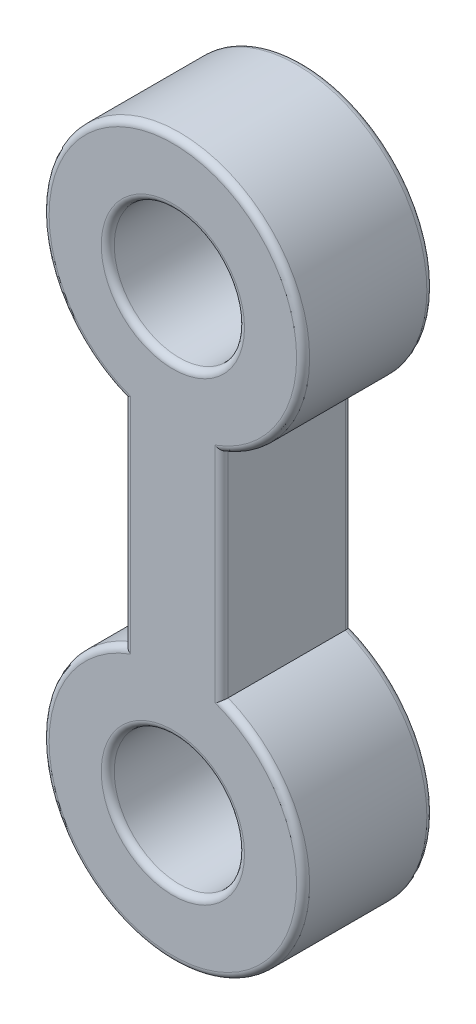
ISO-10303-21;
HEADER;
FILE_DESCRIPTION(('STEP AP214'),'2;1');
FILE_NAME('part.step','',(''),(''),'','','');
FILE_SCHEMA(('AUTOMOTIVE_DESIGN { 1 0 10303 214 1 1 1 1 }'));
ENDSEC;
DATA;
#1=APPLICATION_CONTEXT('core data for automotive mechanical design processes');
#2=APPLICATION_PROTOCOL_DEFINITION('international standard','automotive_design',2000,#1);
#3=PRODUCT_CONTEXT('',#1,'mechanical');
#4=PRODUCT('Part','Part','',(#3));
#5=PRODUCT_RELATED_PRODUCT_CATEGORY('part','',(#4));
#6=PRODUCT_DEFINITION_FORMATION('','',#4);
#7=PRODUCT_DEFINITION_CONTEXT('part definition',#1,'design');
#8=PRODUCT_DEFINITION('design','',#6,#7);
#9=PRODUCT_DEFINITION_SHAPE('','',#8);
#10=(LENGTH_UNIT() NAMED_UNIT(*) SI_UNIT(.MILLI.,.METRE.));
#11=(NAMED_UNIT(*) PLANE_ANGLE_UNIT() SI_UNIT($,.RADIAN.));
#12=(NAMED_UNIT(*) SI_UNIT($,.STERADIAN.) SOLID_ANGLE_UNIT());
#13=UNCERTAINTY_MEASURE_WITH_UNIT(LENGTH_MEASURE(1.E-05),#10,'distance_accuracy_value','');
#14=(GEOMETRIC_REPRESENTATION_CONTEXT(3) GLOBAL_UNCERTAINTY_ASSIGNED_CONTEXT((#13)) GLOBAL_UNIT_ASSIGNED_CONTEXT((#10,
#11,#12)) REPRESENTATION_CONTEXT('',''));
#15=CARTESIAN_POINT('',(0.,0.,0.));
#16=DIRECTION('',(0.,0.,1.));
#17=DIRECTION('',(1.,0.,0.));
#18=AXIS2_PLACEMENT_3D('',#15,#16,#17);
#19=CARTESIAN_POINT('',(0.,0.,10.));
#20=DIRECTION('',(0.,0.,1.));
#21=DIRECTION('',(1.,0.,0.));
#22=AXIS2_PLACEMENT_3D('',#19,#20,#21);
#23=PLANE('',#22);
#24=CARTESIAN_POINT('',(0.,-70.,10.));
#25=DIRECTION('',(0.,0.,1.));
#26=DIRECTION('',(1.,0.,0.));
#27=AXIS2_PLACEMENT_3D('',#24,#25,#26);
#28=CIRCLE('',#27,11.);
#29=CARTESIAN_POINT('',(11.,-70.,10.));
#30=VERTEX_POINT('',#29);
#31=EDGE_CURVE('E11',#30,#30,#28,.F.);
#32=ORIENTED_EDGE('',*,*,#31,.T.);
#33=EDGE_LOOP('',(#32));
#34=FACE_BOUND('',#33,.T.);
#35=CARTESIAN_POINT('',(0.,-70.,10.));
#36=DIRECTION('',(0.,0.,1.));
#37=DIRECTION('',(1.,0.,0.));
#38=AXIS2_PLACEMENT_3D('',#35,#36,#37);
#39=CIRCLE('',#38,19.);
#40=CARTESIAN_POINT('',(-6.49999999999999,-52.1464289286429,10.));
#41=VERTEX_POINT('',#40);
#42=CARTESIAN_POINT('',(6.50000000000001,-52.1464289286429,10.));
#43=VERTEX_POINT('',#42);
#44=EDGE_CURVE('E54',#41,#43,#39,.T.);
#45=ORIENTED_EDGE('',*,*,#44,.T.);
#46=DIRECTION('',(0.,1.,0.));
#47=VECTOR('',#46,1.);
#48=CARTESIAN_POINT('',(6.5,-18.5404962177392,10.));
#49=LINE('',#48,#47);
#50=CARTESIAN_POINT('',(6.5,-17.8535710713571,10.));
#51=VERTEX_POINT('',#50);
#52=EDGE_CURVE('E46',#43,#51,#49,.T.);
#53=ORIENTED_EDGE('',*,*,#52,.T.);
#54=CARTESIAN_POINT('',(0.,0.,10.));
#55=DIRECTION('',(0.,0.,1.));
#56=DIRECTION('',(1.,0.,0.));
#57=AXIS2_PLACEMENT_3D('',#54,#55,#56);
#58=CIRCLE('',#57,19.);
#59=CARTESIAN_POINT('',(-6.5,-17.8535710713571,10.));
#60=VERTEX_POINT('',#59);
#61=EDGE_CURVE('E172',#51,#60,#58,.T.);
#62=ORIENTED_EDGE('',*,*,#61,.T.);
#63=DIRECTION('',(0.,-1.,0.));
#64=VECTOR('',#63,1.);
#65=CARTESIAN_POINT('',(-6.49999999999999,-51.4595037822608,10.));
#66=LINE('',#65,#64);
#67=EDGE_CURVE('E59',#60,#41,#66,.T.);
#68=ORIENTED_EDGE('',*,*,#67,.T.);
#69=EDGE_LOOP('',(#45,#53,#62,#68));
#70=FACE_BOUND('',#69,.T.);
#71=CARTESIAN_POINT('',(0.,0.,10.));
#72=DIRECTION('',(0.,0.,1.));
#73=DIRECTION('',(1.,0.,0.));
#74=AXIS2_PLACEMENT_3D('',#71,#72,#73);
#75=CIRCLE('',#74,11.);
#76=CARTESIAN_POINT('',(11.,0.,10.));
#77=VERTEX_POINT('',#76);
#78=EDGE_CURVE('E169',#77,#77,#75,.F.);
#79=ORIENTED_EDGE('',*,*,#78,.T.);
#80=EDGE_LOOP('',(#79));
#81=FACE_BOUND('',#80,.T.);
#82=ADVANCED_FACE('F32',(#34,#70,#81),#23,.T.);
#83=CARTESIAN_POINT('',(0.,0.,-10.));
#84=DIRECTION('',(0.,0.,1.));
#85=DIRECTION('',(1.,0.,0.));
#86=AXIS2_PLACEMENT_3D('',#83,#84,#85);
#87=PLANE('',#86);
#88=CARTESIAN_POINT('',(0.,-70.,-10.));
#89=DIRECTION('',(0.,0.,1.));
#90=DIRECTION('',(1.,0.,0.));
#91=AXIS2_PLACEMENT_3D('',#88,#89,#90);
#92=CIRCLE('',#91,11.);
#93=CARTESIAN_POINT('',(11.,-70.,-10.));
#94=VERTEX_POINT('',#93);
#95=EDGE_CURVE('E134',#94,#94,#92,.T.);
#96=ORIENTED_EDGE('',*,*,#95,.T.);
#97=EDGE_LOOP('',(#96));
#98=FACE_BOUND('',#97,.T.);
#99=CARTESIAN_POINT('',(0.,0.,-10.));
#100=DIRECTION('',(0.,0.,1.));
#101=DIRECTION('',(1.,0.,0.));
#102=AXIS2_PLACEMENT_3D('',#99,#100,#101);
#103=CIRCLE('',#102,11.);
#104=CARTESIAN_POINT('',(11.,0.,-10.));
#105=VERTEX_POINT('',#104);
#106=EDGE_CURVE('E131',#105,#105,#103,.T.);
#107=ORIENTED_EDGE('',*,*,#106,.T.);
#108=EDGE_LOOP('',(#107));
#109=FACE_BOUND('',#108,.T.);
#110=CARTESIAN_POINT('',(0.,-70.,-10.));
#111=DIRECTION('',(0.,0.,1.));
#112=DIRECTION('',(1.,0.,0.));
#113=AXIS2_PLACEMENT_3D('',#110,#111,#112);
#114=CIRCLE('',#113,19.);
#115=CARTESIAN_POINT('',(6.50000000000001,-52.1464289286429,-10.));
#116=VERTEX_POINT('',#115);
#117=CARTESIAN_POINT('',(-6.49999999999999,-52.1464289286429,-10.));
#118=VERTEX_POINT('',#117);
#119=EDGE_CURVE('E130',#116,#118,#114,.F.);
#120=ORIENTED_EDGE('',*,*,#119,.T.);
#121=DIRECTION('',(0.,-1.,0.));
#122=VECTOR('',#121,1.);
#123=CARTESIAN_POINT('',(-6.5,0.,-10.));
#124=LINE('',#123,#122);
#125=CARTESIAN_POINT('',(-6.5,-17.8535710713571,-10.));
#126=VERTEX_POINT('',#125);
#127=EDGE_CURVE('E109',#118,#126,#124,.F.);
#128=ORIENTED_EDGE('',*,*,#127,.T.);
#129=CARTESIAN_POINT('',(0.,0.,-10.));
#130=DIRECTION('',(0.,0.,1.));
#131=DIRECTION('',(1.,0.,0.));
#132=AXIS2_PLACEMENT_3D('',#129,#130,#131);
#133=CIRCLE('',#132,19.);
#134=CARTESIAN_POINT('',(6.5,-17.8535710713571,-10.));
#135=VERTEX_POINT('',#134);
#136=EDGE_CURVE('E119',#126,#135,#133,.F.);
#137=ORIENTED_EDGE('',*,*,#136,.T.);
#138=DIRECTION('',(0.,1.,0.));
#139=VECTOR('',#138,1.);
#140=CARTESIAN_POINT('',(6.5,0.,-10.));
#141=LINE('',#140,#139);
#142=EDGE_CURVE('E125',#135,#116,#141,.F.);
#143=ORIENTED_EDGE('',*,*,#142,.T.);
#144=EDGE_LOOP('',(#120,#128,#137,#143));
#145=FACE_BOUND('',#144,.T.);
#146=ADVANCED_FACE('F128',(#98,#109,#145),#87,.F.);
#147=CARTESIAN_POINT('',(0.,0.,10.));
#148=DIRECTION('',(0.,0.,-1.));
#149=DIRECTION('',(-1.,0.,0.));
#150=AXIS2_PLACEMENT_3D('',#147,#148,#149);
#151=CYLINDRICAL_SURFACE('',#150,20.);
#152=DIRECTION('',(0.,0.,-1.));
#153=VECTOR('',#152,1.);
#154=CARTESIAN_POINT('',(7.5,-18.5404962177392,10.));
#155=LINE('',#154,#153);
#156=CARTESIAN_POINT('',(7.5,-18.5404962177392,9.));
#157=VERTEX_POINT('',#156);
#158=CARTESIAN_POINT('',(7.5,-18.5404962177392,-9.));
#159=VERTEX_POINT('',#158);
#160=EDGE_CURVE('E325',#157,#159,#155,.T.);
#161=ORIENTED_EDGE('',*,*,#160,.T.);
#162=CARTESIAN_POINT('',(0.,0.,-9.));
#163=DIRECTION('',(0.,0.,1.));
#164=DIRECTION('',(1.,0.,0.));
#165=AXIS2_PLACEMENT_3D('',#162,#163,#164);
#166=CIRCLE('',#165,20.);
#167=CARTESIAN_POINT('',(-7.5,-18.5404962177392,-9.));
#168=VERTEX_POINT('',#167);
#169=EDGE_CURVE('E167',#159,#168,#166,.T.);
#170=ORIENTED_EDGE('',*,*,#169,.T.);
#171=DIRECTION('',(0.,0.,-1.));
#172=VECTOR('',#171,1.);
#173=CARTESIAN_POINT('',(-7.5,-18.5404962177392,10.));
#174=LINE('',#173,#172);
#175=CARTESIAN_POINT('',(-7.5,-18.5404962177392,9.));
#176=VERTEX_POINT('',#175);
#177=EDGE_CURVE('E126',#176,#168,#174,.T.);
#178=ORIENTED_EDGE('',*,*,#177,.F.);
#179=CARTESIAN_POINT('',(0.,0.,9.));
#180=DIRECTION('',(0.,0.,1.));
#181=DIRECTION('',(1.,0.,0.));
#182=AXIS2_PLACEMENT_3D('',#179,#180,#181);
#183=CIRCLE('',#182,20.);
#184=EDGE_CURVE('E165',#176,#157,#183,.F.);
#185=ORIENTED_EDGE('',*,*,#184,.T.);
#186=EDGE_LOOP('',(#161,#170,#178,#185));
#187=FACE_BOUND('',#186,.T.);
#188=ADVANCED_FACE('F264',(#187),#151,.T.);
#189=CARTESIAN_POINT('',(-7.5,-18.5404962177392,10.));
#190=DIRECTION('',(1.,0.,0.));
#191=DIRECTION('',(0.,1.,0.));
#192=AXIS2_PLACEMENT_3D('',#189,#190,#191);
#193=PLANE('',#192);
#194=ORIENTED_EDGE('',*,*,#177,.T.);
#195=DIRECTION('',(0.,-1.,0.));
#196=VECTOR('',#195,1.);
#197=CARTESIAN_POINT('',(-7.5,-18.5404962177392,-9.));
#198=LINE('',#197,#196);
#199=CARTESIAN_POINT('',(-7.49999999999999,-51.4595037822608,-9.));
#200=VERTEX_POINT('',#199);
#201=EDGE_CURVE('E112',#168,#200,#198,.T.);
#202=ORIENTED_EDGE('',*,*,#201,.T.);
#203=DIRECTION('',(0.,0.,-1.));
#204=VECTOR('',#203,1.);
#205=CARTESIAN_POINT('',(-7.49999999999999,-51.4595037822608,10.));
#206=LINE('',#205,#204);
#207=CARTESIAN_POINT('',(-7.49999999999999,-51.4595037822608,9.));
#208=VERTEX_POINT('',#207);
#209=EDGE_CURVE('E327',#208,#200,#206,.T.);
#210=ORIENTED_EDGE('',*,*,#209,.F.);
#211=DIRECTION('',(0.,-1.,0.));
#212=VECTOR('',#211,1.);
#213=CARTESIAN_POINT('',(-7.5,-18.5404962177392,9.));
#214=LINE('',#213,#212);
#215=EDGE_CURVE('E153',#208,#176,#214,.F.);
#216=ORIENTED_EDGE('',*,*,#215,.T.);
#217=EDGE_LOOP('',(#194,#202,#210,#216));
#218=FACE_BOUND('',#217,.T.);
#219=ADVANCED_FACE('F278',(#218),#193,.F.);
#220=CARTESIAN_POINT('',(0.,-70.,10.));
#221=DIRECTION('',(0.,0.,-1.));
#222=DIRECTION('',(-1.,0.,0.));
#223=AXIS2_PLACEMENT_3D('',#220,#221,#222);
#224=CYLINDRICAL_SURFACE('',#223,20.);
#225=ORIENTED_EDGE('',*,*,#209,.T.);
#226=CARTESIAN_POINT('',(0.,-70.,-9.));
#227=DIRECTION('',(0.,0.,1.));
#228=DIRECTION('',(1.,0.,0.));
#229=AXIS2_PLACEMENT_3D('',#226,#227,#228);
#230=CIRCLE('',#229,20.);
#231=CARTESIAN_POINT('',(7.50000000000001,-51.4595037822608,-9.));
#232=VERTEX_POINT('',#231);
#233=EDGE_CURVE('E158',#200,#232,#230,.T.);
#234=ORIENTED_EDGE('',*,*,#233,.T.);
#235=DIRECTION('',(0.,0.,-1.));
#236=VECTOR('',#235,1.);
#237=CARTESIAN_POINT('',(7.50000000000001,-51.4595037822608,10.));
#238=LINE('',#237,#236);
#239=CARTESIAN_POINT('',(7.50000000000001,-51.4595037822608,9.));
#240=VERTEX_POINT('',#239);
#241=EDGE_CURVE('E322',#240,#232,#238,.T.);
#242=ORIENTED_EDGE('',*,*,#241,.F.);
#243=CARTESIAN_POINT('',(0.,-70.,9.));
#244=DIRECTION('',(0.,0.,1.));
#245=DIRECTION('',(1.,0.,0.));
#246=AXIS2_PLACEMENT_3D('',#243,#244,#245);
#247=CIRCLE('',#246,20.);
#248=EDGE_CURVE('E156',#240,#208,#247,.F.);
#249=ORIENTED_EDGE('',*,*,#248,.T.);
#250=EDGE_LOOP('',(#225,#234,#242,#249));
#251=FACE_BOUND('',#250,.T.);
#252=ADVANCED_FACE('F274',(#251),#224,.T.);
#253=CARTESIAN_POINT('',(7.5,-18.5404962177392,10.));
#254=DIRECTION('',(-1.,0.,0.));
#255=DIRECTION('',(0.,-1.,0.));
#256=AXIS2_PLACEMENT_3D('',#253,#254,#255);
#257=PLANE('',#256);
#258=ORIENTED_EDGE('',*,*,#241,.T.);
#259=DIRECTION('',(0.,1.,0.));
#260=VECTOR('',#259,1.);
#261=CARTESIAN_POINT('',(7.5,-18.5404962177392,-9.));
#262=LINE('',#261,#260);
#263=EDGE_CURVE('E163',#232,#159,#262,.T.);
#264=ORIENTED_EDGE('',*,*,#263,.T.);
#265=ORIENTED_EDGE('',*,*,#160,.F.);
#266=DIRECTION('',(0.,1.,0.));
#267=VECTOR('',#266,1.);
#268=CARTESIAN_POINT('',(7.50000000000001,-51.4595037822608,9.));
#269=LINE('',#268,#267);
#270=EDGE_CURVE('E160',#157,#240,#269,.F.);
#271=ORIENTED_EDGE('',*,*,#270,.T.);
#272=EDGE_LOOP('',(#258,#264,#265,#271));
#273=FACE_BOUND('',#272,.T.);
#274=ADVANCED_FACE('F271',(#273),#257,.F.);
#275=CARTESIAN_POINT('',(0.,0.,10.));
#276=DIRECTION('',(0.,0.,-1.));
#277=DIRECTION('',(-1.,0.,0.));
#278=AXIS2_PLACEMENT_3D('',#275,#276,#277);
#279=CYLINDRICAL_SURFACE('',#278,10.);
#280=CARTESIAN_POINT('',(0.,0.,-9.));
#281=DIRECTION('',(0.,0.,1.));
#282=DIRECTION('',(1.,0.,0.));
#283=AXIS2_PLACEMENT_3D('',#280,#281,#282);
#284=CIRCLE('',#283,10.);
#285=CARTESIAN_POINT('',(10.,0.,-9.));
#286=VERTEX_POINT('',#285);
#287=EDGE_CURVE('E150',#286,#286,#284,.F.);
#288=ORIENTED_EDGE('',*,*,#287,.T.);
#289=EDGE_LOOP('',(#288));
#290=FACE_BOUND('',#289,.T.);
#291=CARTESIAN_POINT('',(0.,0.,9.));
#292=DIRECTION('',(0.,0.,1.));
#293=DIRECTION('',(1.,0.,0.));
#294=AXIS2_PLACEMENT_3D('',#291,#292,#293);
#295=CIRCLE('',#294,10.);
#296=CARTESIAN_POINT('',(10.,0.,9.));
#297=VERTEX_POINT('',#296);
#298=EDGE_CURVE('E147',#297,#297,#295,.T.);
#299=ORIENTED_EDGE('',*,*,#298,.T.);
#300=EDGE_LOOP('',(#299));
#301=FACE_BOUND('',#300,.T.);
#302=ADVANCED_FACE('F268',(#290,#301),#279,.F.);
#303=CARTESIAN_POINT('',(0.,-70.,10.));
#304=DIRECTION('',(0.,0.,-1.));
#305=DIRECTION('',(-1.,0.,0.));
#306=AXIS2_PLACEMENT_3D('',#303,#304,#305);
#307=CYLINDRICAL_SURFACE('',#306,10.);
#308=CARTESIAN_POINT('',(0.,-70.,-9.));
#309=DIRECTION('',(0.,0.,1.));
#310=DIRECTION('',(1.,0.,0.));
#311=AXIS2_PLACEMENT_3D('',#308,#309,#310);
#312=CIRCLE('',#311,10.);
#313=CARTESIAN_POINT('',(10.,-70.,-9.));
#314=VERTEX_POINT('',#313);
#315=EDGE_CURVE('E144',#314,#314,#312,.F.);
#316=ORIENTED_EDGE('',*,*,#315,.T.);
#317=EDGE_LOOP('',(#316));
#318=FACE_BOUND('',#317,.T.);
#319=CARTESIAN_POINT('',(0.,-70.,9.));
#320=DIRECTION('',(0.,0.,1.));
#321=DIRECTION('',(1.,0.,0.));
#322=AXIS2_PLACEMENT_3D('',#319,#320,#321);
#323=CIRCLE('',#322,10.);
#324=CARTESIAN_POINT('',(10.,-70.,9.));
#325=VERTEX_POINT('',#324);
#326=EDGE_CURVE('E141',#325,#325,#323,.T.);
#327=ORIENTED_EDGE('',*,*,#326,.T.);
#328=EDGE_LOOP('',(#327));
#329=FACE_BOUND('',#328,.T.);
#330=ADVANCED_FACE('F288',(#318,#329),#307,.F.);
#331=CARTESIAN_POINT('',(0.,-70.,-9.));
#332=DIRECTION('',(0.,0.,1.));
#333=DIRECTION('',(1.,0.,0.));
#334=AXIS2_PLACEMENT_3D('',#331,#332,#333);
#335=TOROIDAL_SURFACE('',#334,11.,1.);
#336=ORIENTED_EDGE('',*,*,#315,.F.);
#337=EDGE_LOOP('',(#336));
#338=FACE_BOUND('',#337,.T.);
#339=ORIENTED_EDGE('',*,*,#95,.F.);
#340=EDGE_LOOP('',(#339));
#341=FACE_BOUND('',#340,.T.);
#342=ADVANCED_FACE('F286',(#338,#341),#335,.T.);
#343=CARTESIAN_POINT('',(0.,0.,-9.));
#344=DIRECTION('',(0.,0.,1.));
#345=DIRECTION('',(1.,0.,0.));
#346=AXIS2_PLACEMENT_3D('',#343,#344,#345);
#347=TOROIDAL_SURFACE('',#346,11.,1.);
#348=ORIENTED_EDGE('',*,*,#287,.F.);
#349=EDGE_LOOP('',(#348));
#350=FACE_BOUND('',#349,.T.);
#351=ORIENTED_EDGE('',*,*,#106,.F.);
#352=EDGE_LOOP('',(#351));
#353=FACE_BOUND('',#352,.T.);
#354=ADVANCED_FACE('F213',(#350,#353),#347,.T.);
#355=CARTESIAN_POINT('',(6.5,-18.5404962177392,-9.));
#356=DIRECTION('',(0.,1.,0.));
#357=DIRECTION('',(-1.,0.,0.));
#358=AXIS2_PLACEMENT_3D('',#355,#356,#357);
#359=CYLINDRICAL_SURFACE('',#358,1.);
#360=CARTESIAN_POINT('',(7.50000000000001,-51.4595037822608,-9.));
#361=CARTESIAN_POINT('',(7.5000018976937,-51.4595026043384,-9.02469557126901));
#362=CARTESIAN_POINT('',(7.49908446359424,-51.4601210271123,-9.04937783193884));
#363=CARTESIAN_POINT('',(7.49543833573052,-51.4625794492258,-9.09853701940789));
#364=CARTESIAN_POINT('',(7.49271038364174,-51.4644189483537,-9.12301402613303));
#365=CARTESIAN_POINT('',(7.48189376100379,-51.4717143578347,-9.19561058121729));
#366=CARTESIAN_POINT('',(7.47117157764479,-51.4789476645999,-9.24319343216988));
#367=CARTESIAN_POINT('',(7.44330371697542,-51.4977655453967,-9.33541207747412));
#368=CARTESIAN_POINT('',(7.42616581189549,-51.5093448545722,-9.38005136111824));
#369=CARTESIAN_POINT('',(7.38628330244707,-51.5363258219173,-9.46554204788778));
#370=CARTESIAN_POINT('',(7.36353264463759,-51.5517316071231,-9.50638929534488));
#371=CARTESIAN_POINT('',(7.3118063070115,-51.5868122556768,-9.58596941034456));
#372=CARTESIAN_POINT('',(7.28253378977325,-51.6066914315319,-9.62441765058433));
#373=CARTESIAN_POINT('',(7.21978477451096,-51.6493848773834,-9.69582434706756));
#374=CARTESIAN_POINT('',(7.18630749885937,-51.6721996903153,-9.72878178521296));
#375=CARTESIAN_POINT('',(7.11040415203343,-51.7240355166642,-9.79391148569647));
#376=CARTESIAN_POINT('',(7.06740673577812,-51.7534633186864,-9.82509293251835));
#377=CARTESIAN_POINT('',(6.97824901474556,-51.8146442306898,-9.87978362130724));
#378=CARTESIAN_POINT('',(6.93208430442952,-51.8464005839609,-9.90328190347743));
#379=CARTESIAN_POINT('',(6.82376706493336,-51.9211187082728,-9.94845139410932));
#380=CARTESIAN_POINT('',(6.76091166467115,-51.9646251240664,-9.96754419030609));
#381=CARTESIAN_POINT('',(6.63376141351095,-52.05296731462,-9.9931274266423));
#382=CARTESIAN_POINT('',(6.56946967618564,-52.0978002715304,-9.99964287098959));
#383=CARTESIAN_POINT('',(6.50356311398428,-52.1439343793164,-9.99999524228929));
#384=CARTESIAN_POINT('',(6.50178148239448,-52.1451816401532,-10.0000000029543));
#385=CARTESIAN_POINT('',(6.50000000000001,-52.1464289286429,-10.));
#386=B_SPLINE_CURVE_WITH_KNOTS('',3,(#360,#361,#362,#363,#364,#365,#366,#367,#368,#369,#370,
#371,#372,#373,#374,#375,#376,#377,#378,#379,#380,#381,#382,#383,#384,#385),.UNSPECIFIED.,.F.,
.F.,(4,2,2,2,2,2,2,2,2,2,2,2,4),(0.,0.0740361905573395,0.148042071024502,0.295173080104486,
0.442126423290589,0.589238956169167,0.745400938242295,0.90159184353798,1.08306771193246,
1.26480133198613,1.50008249081373,1.73489541893545,1.74141988969473),.UNSPECIFIED.);
#387=EDGE_CURVE('E115',#116,#232,#386,.F.);
#388=ORIENTED_EDGE('',*,*,#387,.F.);
#389=ORIENTED_EDGE('',*,*,#142,.F.);
#390=CARTESIAN_POINT('',(7.5,-18.5404962177392,-9.));
#391=CARTESIAN_POINT('',(7.5000018976937,-18.5404973956616,-9.02469557126901));
#392=CARTESIAN_POINT('',(7.49908446359424,-18.5398789728877,-9.04937783193884));
#393=CARTESIAN_POINT('',(7.49543833573051,-18.5374205507742,-9.09853701940789));
#394=CARTESIAN_POINT('',(7.49271038364174,-18.5355810516463,-9.12301402613303));
#395=CARTESIAN_POINT('',(7.48189376100379,-18.5282856421653,-9.19561058121729));
#396=CARTESIAN_POINT('',(7.47117157764479,-18.5210523354001,-9.24319343216988));
#397=CARTESIAN_POINT('',(7.44330371697541,-18.5022344546033,-9.33541207747412));
#398=CARTESIAN_POINT('',(7.42616581189549,-18.4906551454278,-9.38005136111824));
#399=CARTESIAN_POINT('',(7.38628330244706,-18.4636741780827,-9.46554204788778));
#400=CARTESIAN_POINT('',(7.36353264463758,-18.4482683928769,-9.50638929534488));
#401=CARTESIAN_POINT('',(7.3118063070115,-18.4131877443232,-9.58596941034456));
#402=CARTESIAN_POINT('',(7.28253378977325,-18.3933085684681,-9.62441765058433));
#403=CARTESIAN_POINT('',(7.21978477451096,-18.3506151226166,-9.69582434706756));
#404=CARTESIAN_POINT('',(7.18630749885936,-18.3278003096847,-9.72878178521296));
#405=CARTESIAN_POINT('',(7.11040415203343,-18.2759644833358,-9.79391148569648));
#406=CARTESIAN_POINT('',(7.06740673577812,-18.2465366813136,-9.82509293251835));
#407=CARTESIAN_POINT('',(6.97824901474555,-18.1853557693102,-9.87978362130725));
#408=CARTESIAN_POINT('',(6.93208430442951,-18.1535994160391,-9.90328190347743));
#409=CARTESIAN_POINT('',(6.82376706493336,-18.0788812917272,-9.94845139410932));
#410=CARTESIAN_POINT('',(6.76091166467116,-18.0353748759335,-9.96754419030609));
#411=CARTESIAN_POINT('',(6.63376141351094,-17.94703268538,-9.9931274266423));
#412=CARTESIAN_POINT('',(6.5694696761856,-17.9021997284696,-9.99964287098959));
#413=CARTESIAN_POINT('',(6.50356311398428,-17.8560656206836,-9.99999524228929));
#414=CARTESIAN_POINT('',(6.50178148239448,-17.8548183598468,-10.0000000029543));
#415=CARTESIAN_POINT('',(6.5,-17.8535710713571,-10.));
#416=B_SPLINE_CURVE_WITH_KNOTS('',3,(#390,#391,#392,#393,#394,#395,#396,#397,#398,#399,#400,
#401,#402,#403,#404,#405,#406,#407,#408,#409,#410,#411,#412,#413,#414,#415),.UNSPECIFIED.,.F.,
.F.,(4,2,2,2,2,2,2,2,2,2,2,2,4),(0.,0.0740361905573395,0.148042071024501,0.295173080104486,
0.442126423290588,0.589238956169167,0.745400938242297,0.901591843537984,1.08306771193246,
1.26480133198613,1.50008249081373,1.73489541893545,1.74141988969473),.UNSPECIFIED.);
#417=EDGE_CURVE('E122',#159,#135,#416,.T.);
#418=ORIENTED_EDGE('',*,*,#417,.F.);
#419=ORIENTED_EDGE('',*,*,#263,.F.);
#420=EDGE_LOOP('',(#388,#389,#418,#419));
#421=FACE_BOUND('',#420,.T.);
#422=ADVANCED_FACE('F209',(#421),#359,.T.);
#423=CARTESIAN_POINT('',(0.,0.,-9.));
#424=DIRECTION('',(0.,0.,1.));
#425=DIRECTION('',(1.,0.,0.));
#426=AXIS2_PLACEMENT_3D('',#423,#424,#425);
#427=TOROIDAL_SURFACE('',#426,19.,1.);
#428=ORIENTED_EDGE('',*,*,#417,.T.);
#429=ORIENTED_EDGE('',*,*,#136,.F.);
#430=CARTESIAN_POINT('',(-7.5,-18.5404962177392,-9.));
#431=CARTESIAN_POINT('',(-7.50000189769369,-18.5404973956616,-9.02469557126901));
#432=CARTESIAN_POINT('',(-7.49908446359424,-18.5398789728877,-9.04937783193884));
#433=CARTESIAN_POINT('',(-7.49543833573051,-18.5374205507742,-9.09853701940789));
#434=CARTESIAN_POINT('',(-7.49271038364173,-18.5355810516463,-9.12301402613303));
#435=CARTESIAN_POINT('',(-7.48189376100378,-18.5282856421653,-9.19561058121729));
#436=CARTESIAN_POINT('',(-7.47117157764478,-18.5210523354002,-9.24319343216988));
#437=CARTESIAN_POINT('',(-7.44330371697541,-18.5022344546033,-9.33541207747412));
#438=CARTESIAN_POINT('',(-7.42616581189548,-18.4906551454278,-9.38005136111823));
#439=CARTESIAN_POINT('',(-7.38628330244706,-18.4636741780827,-9.46554204788778));
#440=CARTESIAN_POINT('',(-7.36353264463758,-18.4482683928769,-9.50638929534488));
#441=CARTESIAN_POINT('',(-7.31180630701149,-18.4131877443232,-9.58596941034455));
#442=CARTESIAN_POINT('',(-7.28253378977324,-18.3933085684681,-9.62441765058433));
#443=CARTESIAN_POINT('',(-7.21978477451095,-18.3506151226166,-9.69582434706756));
#444=CARTESIAN_POINT('',(-7.18630749885936,-18.3278003096847,-9.72878178521296));
#445=CARTESIAN_POINT('',(-7.11040415203342,-18.2759644833358,-9.79391148569648));
#446=CARTESIAN_POINT('',(-7.06740673577811,-18.2465366813136,-9.82509293251835));
#447=CARTESIAN_POINT('',(-6.97824901474555,-18.1853557693102,-9.87978362130725));
#448=CARTESIAN_POINT('',(-6.93208430442951,-18.1535994160391,-9.90328190347743));
#449=CARTESIAN_POINT('',(-6.82376706493335,-18.0788812917272,-9.94845139410932));
#450=CARTESIAN_POINT('',(-6.76091166467112,-18.0353748759336,-9.96754419030609));
#451=CARTESIAN_POINT('',(-6.63376141351097,-17.94703268538,-9.9931274266423));
#452=CARTESIAN_POINT('',(-6.56946967618571,-17.9021997284695,-9.99964287098959));
#453=CARTESIAN_POINT('',(-6.50356311398428,-17.8560656206836,-9.99999524228929));
#454=CARTESIAN_POINT('',(-6.50178148239448,-17.8548183598468,-10.0000000029543));
#455=CARTESIAN_POINT('',(-6.5,-17.8535710713571,-10.));
#456=B_SPLINE_CURVE_WITH_KNOTS('',3,(#430,#431,#432,#433,#434,#435,#436,#437,#438,#439,#440,
#441,#442,#443,#444,#445,#446,#447,#448,#449,#450,#451,#452,#453,#454,#455),.UNSPECIFIED.,.F.,
.F.,(4,2,2,2,2,2,2,2,2,2,2,2,4),(0.,0.0740361905573395,0.148042071024502,0.295173080104485,
0.442126423290587,0.589238956169166,0.745400938242296,0.901591843537983,1.08306771193246,
1.26480133198613,1.50008249081372,1.73489541893545,1.74141988969472),.UNSPECIFIED.);
#457=EDGE_CURVE('E105',#168,#126,#456,.T.);
#458=ORIENTED_EDGE('',*,*,#457,.F.);
#459=ORIENTED_EDGE('',*,*,#169,.F.);
#460=EDGE_LOOP('',(#428,#429,#458,#459));
#461=FACE_BOUND('',#460,.T.);
#462=ADVANCED_FACE('F120',(#461),#427,.T.);
#463=CARTESIAN_POINT('',(0.,-70.,-9.));
#464=DIRECTION('',(0.,0.,1.));
#465=DIRECTION('',(1.,0.,0.));
#466=AXIS2_PLACEMENT_3D('',#463,#464,#465);
#467=TOROIDAL_SURFACE('',#466,19.,1.);
#468=ORIENTED_EDGE('',*,*,#387,.T.);
#469=ORIENTED_EDGE('',*,*,#233,.F.);
#470=CARTESIAN_POINT('',(-7.49999999999999,-51.4595037822608,-9.));
#471=CARTESIAN_POINT('',(-7.50000189769369,-51.4595026043384,-9.02469557126901));
#472=CARTESIAN_POINT('',(-7.49908446359423,-51.4601210271123,-9.04937783193884));
#473=CARTESIAN_POINT('',(-7.4954383357305,-51.4625794492258,-9.09853701940789));
#474=CARTESIAN_POINT('',(-7.49271038364173,-51.4644189483537,-9.12301402613303));
#475=CARTESIAN_POINT('',(-7.48189376100378,-51.4717143578347,-9.19561058121729));
#476=CARTESIAN_POINT('',(-7.47117157764478,-51.4789476645999,-9.24319343216988));
#477=CARTESIAN_POINT('',(-7.4433037169754,-51.4977655453967,-9.33541207747412));
#478=CARTESIAN_POINT('',(-7.42616581189548,-51.5093448545722,-9.38005136111824));
#479=CARTESIAN_POINT('',(-7.38628330244706,-51.5363258219173,-9.46554204788778));
#480=CARTESIAN_POINT('',(-7.36353264463757,-51.5517316071231,-9.50638929534488));
#481=CARTESIAN_POINT('',(-7.31180630701149,-51.5868122556768,-9.58596941034456));
#482=CARTESIAN_POINT('',(-7.28253378977324,-51.6066914315319,-9.62441765058433));
#483=CARTESIAN_POINT('',(-7.21978477451095,-51.6493848773834,-9.69582434706756));
#484=CARTESIAN_POINT('',(-7.18630749885935,-51.6721996903153,-9.72878178521296));
#485=CARTESIAN_POINT('',(-7.11040415203342,-51.7240355166642,-9.79391148569647));
#486=CARTESIAN_POINT('',(-7.06740673577811,-51.7534633186864,-9.82509293251835));
#487=CARTESIAN_POINT('',(-6.97824901474555,-51.8146442306898,-9.87978362130725));
#488=CARTESIAN_POINT('',(-6.9320843044295,-51.8464005839609,-9.90328190347744));
#489=CARTESIAN_POINT('',(-6.82376706493335,-51.9211187082728,-9.94845139410933));
#490=CARTESIAN_POINT('',(-6.76091166467116,-51.9646251240665,-9.96754419030609));
#491=CARTESIAN_POINT('',(-6.63376141351092,-52.0529673146199,-9.9931274266423));
#492=CARTESIAN_POINT('',(-6.56946967618555,-52.0978002715303,-9.99964287098959));
#493=CARTESIAN_POINT('',(-6.50356311398427,-52.1439343793164,-9.99999524228929));
#494=CARTESIAN_POINT('',(-6.50178148239447,-52.1451816401532,-10.0000000029543));
#495=CARTESIAN_POINT('',(-6.5,-52.1464289286429,-10.));
#496=B_SPLINE_CURVE_WITH_KNOTS('',3,(#470,#471,#472,#473,#474,#475,#476,#477,#478,#479,#480,
#481,#482,#483,#484,#485,#486,#487,#488,#489,#490,#491,#492,#493,#494,#495),.UNSPECIFIED.,.F.,
.F.,(4,2,2,2,2,2,2,2,2,2,2,2,4),(0.,0.0740361905573393,0.148042071024502,0.295173080104486,
0.442126423290588,0.589238956169166,0.745400938242293,0.901591843537981,1.08306771193246,
1.26480133198613,1.50008249081373,1.73489541893546,1.74141988969472),.UNSPECIFIED.);
#497=EDGE_CURVE('E116',#118,#200,#496,.F.);
#498=ORIENTED_EDGE('',*,*,#497,.F.);
#499=ORIENTED_EDGE('',*,*,#119,.F.);
#500=EDGE_LOOP('',(#468,#469,#498,#499));
#501=FACE_BOUND('',#500,.T.);
#502=ADVANCED_FACE('F191',(#501),#467,.T.);
#503=CARTESIAN_POINT('',(-6.5,-18.5404962177392,-9.));
#504=DIRECTION('',(0.,-1.,0.));
#505=DIRECTION('',(1.,0.,0.));
#506=AXIS2_PLACEMENT_3D('',#503,#504,#505);
#507=CYLINDRICAL_SURFACE('',#506,1.);
#508=ORIENTED_EDGE('',*,*,#457,.T.);
#509=ORIENTED_EDGE('',*,*,#127,.F.);
#510=ORIENTED_EDGE('',*,*,#497,.T.);
#511=ORIENTED_EDGE('',*,*,#201,.F.);
#512=EDGE_LOOP('',(#508,#509,#510,#511));
#513=FACE_BOUND('',#512,.T.);
#514=ADVANCED_FACE('F107',(#513),#507,.T.);
#515=CARTESIAN_POINT('',(0.,-70.,9.));
#516=DIRECTION('',(0.,0.,1.));
#517=DIRECTION('',(1.,0.,0.));
#518=AXIS2_PLACEMENT_3D('',#515,#516,#517);
#519=TOROIDAL_SURFACE('',#518,11.,1.);
#520=ORIENTED_EDGE('',*,*,#31,.F.);
#521=EDGE_LOOP('',(#520));
#522=FACE_BOUND('',#521,.T.);
#523=ORIENTED_EDGE('',*,*,#326,.F.);
#524=EDGE_LOOP('',(#523));
#525=FACE_BOUND('',#524,.T.);
#526=ADVANCED_FACE('F215',(#522,#525),#519,.T.);
#527=CARTESIAN_POINT('',(-6.5,0.,9.));
#528=DIRECTION('',(0.,1.,0.));
#529=DIRECTION('',(-1.,0.,0.));
#530=AXIS2_PLACEMENT_3D('',#527,#528,#529);
#531=CYLINDRICAL_SURFACE('',#530,1.);
#532=CARTESIAN_POINT('',(-7.5,-18.5404962177392,9.));
#533=CARTESIAN_POINT('',(-7.50000189769369,-18.5404973956616,9.02469557126901));
#534=CARTESIAN_POINT('',(-7.49908446359424,-18.5398789728877,9.04937783193884));
#535=CARTESIAN_POINT('',(-7.49543833573051,-18.5374205507742,9.09853701940789));
#536=CARTESIAN_POINT('',(-7.49271038364173,-18.5355810516463,9.12301402613303));
#537=CARTESIAN_POINT('',(-7.48189376100378,-18.5282856421653,9.19561058121729));
#538=CARTESIAN_POINT('',(-7.47117157764478,-18.5210523354001,9.24319343216988));
#539=CARTESIAN_POINT('',(-7.44330371697541,-18.5022344546033,9.33541207747412));
#540=CARTESIAN_POINT('',(-7.42616581189548,-18.4906551454278,9.38005136111823));
#541=CARTESIAN_POINT('',(-7.38628330244706,-18.4636741780827,9.46554204788778));
#542=CARTESIAN_POINT('',(-7.36353264463758,-18.4482683928769,9.50638929534488));
#543=CARTESIAN_POINT('',(-7.31180630701149,-18.4131877443232,9.58596941034455));
#544=CARTESIAN_POINT('',(-7.28253378977324,-18.3933085684681,9.62441765058433));
#545=CARTESIAN_POINT('',(-7.21978477451095,-18.3506151226166,9.69582434706756));
#546=CARTESIAN_POINT('',(-7.18630749885936,-18.3278003096847,9.72878178521296));
#547=CARTESIAN_POINT('',(-7.11040415203342,-18.2759644833358,9.79391148569647));
#548=CARTESIAN_POINT('',(-7.06740673577811,-18.2465366813136,9.82509293251835));
#549=CARTESIAN_POINT('',(-6.97824901474555,-18.1853557693102,9.87978362130725));
#550=CARTESIAN_POINT('',(-6.9320843044295,-18.1535994160391,9.90328190347743));
#551=CARTESIAN_POINT('',(-6.82376706493335,-18.0788812917272,9.94845139410932));
#552=CARTESIAN_POINT('',(-6.76091166467116,-18.0353748759335,9.96754419030609));
#553=CARTESIAN_POINT('',(-6.63376141351093,-17.94703268538,9.9931274266423));
#554=CARTESIAN_POINT('',(-6.56946967618557,-17.9021997284697,9.99964287098958));
#555=CARTESIAN_POINT('',(-6.50356311398427,-17.8560656206836,9.99999524228929));
#556=CARTESIAN_POINT('',(-6.50178148239447,-17.8548183598468,10.0000000029543));
#557=CARTESIAN_POINT('',(-6.5,-17.8535710713571,10.));
#558=B_SPLINE_CURVE_WITH_KNOTS('',3,(#532,#533,#534,#535,#536,#537,#538,#539,#540,#541,#542,
#543,#544,#545,#546,#547,#548,#549,#550,#551,#552,#553,#554,#555,#556,#557),.UNSPECIFIED.,.F.,
.F.,(4,2,2,2,2,2,2,2,2,2,2,2,4),(0.,0.0740361905573377,0.148042071024502,0.295173080104486,
0.442126423290588,0.589238956169168,0.745400938242298,0.901591843537982,1.08306771193246,
1.26480133198613,1.50008249081373,1.73489541893545,1.74141988969472),.UNSPECIFIED.);
#559=EDGE_CURVE('E236',#176,#60,#558,.T.);
#560=ORIENTED_EDGE('',*,*,#559,.F.);
#561=ORIENTED_EDGE('',*,*,#215,.F.);
#562=CARTESIAN_POINT('',(-7.49999999999999,-51.4595037822608,9.));
#563=CARTESIAN_POINT('',(-7.50000189769369,-51.4595026043384,9.02469557126901));
#564=CARTESIAN_POINT('',(-7.49908446359423,-51.4601210271123,9.04937783193884));
#565=CARTESIAN_POINT('',(-7.4954383357305,-51.4625794492258,9.09853701940789));
#566=CARTESIAN_POINT('',(-7.49271038364173,-51.4644189483537,9.12301402613303));
#567=CARTESIAN_POINT('',(-7.48189376100378,-51.4717143578347,9.19561058121729));
#568=CARTESIAN_POINT('',(-7.47117157764478,-51.4789476645999,9.24319343216988));
#569=CARTESIAN_POINT('',(-7.4433037169754,-51.4977655453967,9.33541207747411));
#570=CARTESIAN_POINT('',(-7.42616581189548,-51.5093448545722,9.38005136111823));
#571=CARTESIAN_POINT('',(-7.38628330244706,-51.5363258219173,9.46554204788778));
#572=CARTESIAN_POINT('',(-7.36353264463757,-51.5517316071231,9.50638929534488));
#573=CARTESIAN_POINT('',(-7.31180630701149,-51.5868122556768,9.58596941034456));
#574=CARTESIAN_POINT('',(-7.28253378977324,-51.6066914315319,9.62441765058433));
#575=CARTESIAN_POINT('',(-7.21978477451095,-51.6493848773834,9.69582434706756));
#576=CARTESIAN_POINT('',(-7.18630749885935,-51.6721996903153,9.72878178521295));
#577=CARTESIAN_POINT('',(-7.11040415203342,-51.7240355166642,9.79391148569647));
#578=CARTESIAN_POINT('',(-7.06740673577811,-51.7534633186864,9.82509293251835));
#579=CARTESIAN_POINT('',(-6.97824901474554,-51.8146442306898,9.87978362130725));
#580=CARTESIAN_POINT('',(-6.9320843044295,-51.8464005839609,9.90328190347744));
#581=CARTESIAN_POINT('',(-6.82376706493335,-51.9211187082728,9.94845139410932));
#582=CARTESIAN_POINT('',(-6.76091166467116,-51.9646251240665,9.96754419030609));
#583=CARTESIAN_POINT('',(-6.63376141351092,-52.0529673146199,9.9931274266423));
#584=CARTESIAN_POINT('',(-6.56946967618555,-52.0978002715303,9.99964287098958));
#585=CARTESIAN_POINT('',(-6.50356311398426,-52.1439343793164,9.99999524228929));
#586=CARTESIAN_POINT('',(-6.50178148239447,-52.1451816401532,10.0000000029543));
#587=CARTESIAN_POINT('',(-6.49999999999999,-52.1464289286429,10.));
#588=B_SPLINE_CURVE_WITH_KNOTS('',3,(#562,#563,#564,#565,#566,#567,#568,#569,#570,#571,#572,
#573,#574,#575,#576,#577,#578,#579,#580,#581,#582,#583,#584,#585,#586,#587),.UNSPECIFIED.,.F.,
.F.,(4,2,2,2,2,2,2,2,2,2,2,2,4),(0.,0.0740361905573393,0.148042071024502,0.295173080104486,
0.442126423290588,0.589238956169167,0.745400938242301,0.90159184353798,1.08306771193247,
1.26480133198613,1.50008249081373,1.73489541893546,1.74141988969473),.UNSPECIFIED.);
#589=EDGE_CURVE('E36',#41,#208,#588,.F.);
#590=ORIENTED_EDGE('',*,*,#589,.F.);
#591=ORIENTED_EDGE('',*,*,#67,.F.);
#592=EDGE_LOOP('',(#560,#561,#590,#591));
#593=FACE_BOUND('',#592,.T.);
#594=ADVANCED_FACE('F219',(#593),#531,.T.);
#595=CARTESIAN_POINT('',(0.,-70.,9.));
#596=DIRECTION('',(0.,0.,1.));
#597=DIRECTION('',(1.,0.,0.));
#598=AXIS2_PLACEMENT_3D('',#595,#596,#597);
#599=TOROIDAL_SURFACE('',#598,19.,1.);
#600=ORIENTED_EDGE('',*,*,#589,.T.);
#601=ORIENTED_EDGE('',*,*,#248,.F.);
#602=CARTESIAN_POINT('',(7.50000000000001,-51.4595037822608,9.));
#603=CARTESIAN_POINT('',(7.5000018976937,-51.4595026043384,9.02469557126901));
#604=CARTESIAN_POINT('',(7.49908446359424,-51.4601210271123,9.04937783193884));
#605=CARTESIAN_POINT('',(7.49543833573052,-51.4625794492258,9.09853701940789));
#606=CARTESIAN_POINT('',(7.49271038364174,-51.4644189483537,9.12301402613303));
#607=CARTESIAN_POINT('',(7.48189376100379,-51.4717143578347,9.19561058121729));
#608=CARTESIAN_POINT('',(7.47117157764479,-51.4789476645999,9.24319343216988));
#609=CARTESIAN_POINT('',(7.44330371697542,-51.4977655453967,9.33541207747411));
#610=CARTESIAN_POINT('',(7.42616581189549,-51.5093448545722,9.38005136111823));
#611=CARTESIAN_POINT('',(7.38628330244707,-51.5363258219173,9.46554204788777));
#612=CARTESIAN_POINT('',(7.36353264463759,-51.5517316071231,9.50638929534488));
#613=CARTESIAN_POINT('',(7.3118063070115,-51.5868122556768,9.58596941034455));
#614=CARTESIAN_POINT('',(7.28253378977325,-51.6066914315319,9.62441765058433));
#615=CARTESIAN_POINT('',(7.21978477451096,-51.6493848773834,9.69582434706756));
#616=CARTESIAN_POINT('',(7.18630749885937,-51.6721996903153,9.72878178521295));
#617=CARTESIAN_POINT('',(7.11040415203343,-51.7240355166642,9.79391148569647));
#618=CARTESIAN_POINT('',(7.06740673577812,-51.7534633186864,9.82509293251835));
#619=CARTESIAN_POINT('',(6.97824901474556,-51.8146442306898,9.87978362130724));
#620=CARTESIAN_POINT('',(6.93208430442952,-51.8464005839609,9.90328190347743));
#621=CARTESIAN_POINT('',(6.82376706493336,-51.9211187082728,9.94845139410932));
#622=CARTESIAN_POINT('',(6.76091166467115,-51.9646251240664,9.96754419030609));
#623=CARTESIAN_POINT('',(6.63376141351095,-52.05296731462,9.9931274266423));
#624=CARTESIAN_POINT('',(6.56946967618564,-52.0978002715304,9.99964287098958));
#625=CARTESIAN_POINT('',(6.50356311398428,-52.1439343793164,9.99999524228929));
#626=CARTESIAN_POINT('',(6.50178148239448,-52.1451816401532,10.0000000029543));
#627=CARTESIAN_POINT('',(6.50000000000001,-52.1464289286429,10.));
#628=B_SPLINE_CURVE_WITH_KNOTS('',3,(#602,#603,#604,#605,#606,#607,#608,#609,#610,#611,#612,
#613,#614,#615,#616,#617,#618,#619,#620,#621,#622,#623,#624,#625,#626,#627),.UNSPECIFIED.,.F.,
.F.,(4,2,2,2,2,2,2,2,2,2,2,2,4),(0.,0.0740361905573394,0.148042071024502,0.295173080104486,
0.442126423290587,0.589238956169166,0.745400938242294,0.90159184353798,1.08306771193246,
1.26480133198613,1.50008249081373,1.73489541893545,1.74141988969473),.UNSPECIFIED.);
#629=EDGE_CURVE('E242',#43,#240,#628,.F.);
#630=ORIENTED_EDGE('',*,*,#629,.F.);
#631=ORIENTED_EDGE('',*,*,#44,.F.);
#632=EDGE_LOOP('',(#600,#601,#630,#631));
#633=FACE_BOUND('',#632,.T.);
#634=ADVANCED_FACE('F226',(#633),#599,.T.);
#635=CARTESIAN_POINT('',(0.,0.,9.));
#636=DIRECTION('',(0.,0.,1.));
#637=DIRECTION('',(1.,0.,0.));
#638=AXIS2_PLACEMENT_3D('',#635,#636,#637);
#639=TOROIDAL_SURFACE('',#638,19.,1.);
#640=ORIENTED_EDGE('',*,*,#559,.T.);
#641=ORIENTED_EDGE('',*,*,#61,.F.);
#642=CARTESIAN_POINT('',(7.5,-18.5404962177392,9.));
#643=CARTESIAN_POINT('',(7.5000018976937,-18.5404973956616,9.02469557126901));
#644=CARTESIAN_POINT('',(7.49908446359424,-18.5398789728877,9.04937783193884));
#645=CARTESIAN_POINT('',(7.49543833573051,-18.5374205507742,9.09853701940789));
#646=CARTESIAN_POINT('',(7.49271038364174,-18.5355810516463,9.12301402613303));
#647=CARTESIAN_POINT('',(7.48189376100379,-18.5282856421653,9.19561058121729));
#648=CARTESIAN_POINT('',(7.47117157764479,-18.5210523354001,9.24319343216988));
#649=CARTESIAN_POINT('',(7.44330371697541,-18.5022344546033,9.33541207747411));
#650=CARTESIAN_POINT('',(7.42616581189549,-18.4906551454278,9.38005136111823));
#651=CARTESIAN_POINT('',(7.38628330244707,-18.4636741780827,9.46554204788778));
#652=CARTESIAN_POINT('',(7.36353264463758,-18.4482683928769,9.50638929534488));
#653=CARTESIAN_POINT('',(7.3118063070115,-18.4131877443232,9.58596941034455));
#654=CARTESIAN_POINT('',(7.28253378977325,-18.3933085684681,9.62441765058433));
#655=CARTESIAN_POINT('',(7.21978477451096,-18.3506151226166,9.69582434706756));
#656=CARTESIAN_POINT('',(7.18630749885936,-18.3278003096847,9.72878178521296));
#657=CARTESIAN_POINT('',(7.11040415203343,-18.2759644833358,9.79391148569648));
#658=CARTESIAN_POINT('',(7.06740673577812,-18.2465366813136,9.82509293251835));
#659=CARTESIAN_POINT('',(6.97824901474556,-18.1853557693102,9.87978362130724));
#660=CARTESIAN_POINT('',(6.93208430442951,-18.1535994160391,9.90328190347743));
#661=CARTESIAN_POINT('',(6.82376706493336,-18.0788812917272,9.94845139410932));
#662=CARTESIAN_POINT('',(6.76091166467116,-18.0353748759335,9.96754419030609));
#663=CARTESIAN_POINT('',(6.63376141351094,-17.94703268538,9.9931274266423));
#664=CARTESIAN_POINT('',(6.5694696761856,-17.9021997284696,9.99964287098958));
#665=CARTESIAN_POINT('',(6.50356311398428,-17.8560656206836,9.99999524228929));
#666=CARTESIAN_POINT('',(6.50178148239448,-17.8548183598468,10.0000000029543));
#667=CARTESIAN_POINT('',(6.5,-17.8535710713571,10.));
#668=B_SPLINE_CURVE_WITH_KNOTS('',3,(#642,#643,#644,#645,#646,#647,#648,#649,#650,#651,#652,
#653,#654,#655,#656,#657,#658,#659,#660,#661,#662,#663,#664,#665,#666,#667),.UNSPECIFIED.,.F.,
.F.,(4,2,2,2,2,2,2,2,2,2,2,2,4),(0.,0.0740361905573395,0.148042071024501,0.295173080104486,
0.442126423290586,0.589238956169167,0.745400938242298,0.901591843537984,1.08306771193246,
1.26480133198613,1.50008249081373,1.73489541893545,1.74141988969473),.UNSPECIFIED.);
#669=EDGE_CURVE('E230',#157,#51,#668,.T.);
#670=ORIENTED_EDGE('',*,*,#669,.F.);
#671=ORIENTED_EDGE('',*,*,#184,.F.);
#672=EDGE_LOOP('',(#640,#641,#670,#671));
#673=FACE_BOUND('',#672,.T.);
#674=ADVANCED_FACE('F221',(#673),#639,.T.);
#675=CARTESIAN_POINT('',(6.5,0.,9.));
#676=DIRECTION('',(0.,-1.,0.));
#677=DIRECTION('',(1.,0.,0.));
#678=AXIS2_PLACEMENT_3D('',#675,#676,#677);
#679=CYLINDRICAL_SURFACE('',#678,1.);
#680=ORIENTED_EDGE('',*,*,#629,.T.);
#681=ORIENTED_EDGE('',*,*,#270,.F.);
#682=ORIENTED_EDGE('',*,*,#669,.T.);
#683=ORIENTED_EDGE('',*,*,#52,.F.);
#684=EDGE_LOOP('',(#680,#681,#682,#683));
#685=FACE_BOUND('',#684,.T.);
#686=ADVANCED_FACE('F225',(#685),#679,.T.);
#687=CARTESIAN_POINT('',(0.,0.,9.));
#688=DIRECTION('',(0.,0.,1.));
#689=DIRECTION('',(1.,0.,0.));
#690=AXIS2_PLACEMENT_3D('',#687,#688,#689);
#691=TOROIDAL_SURFACE('',#690,11.,1.);
#692=ORIENTED_EDGE('',*,*,#78,.F.);
#693=EDGE_LOOP('',(#692));
#694=FACE_BOUND('',#693,.T.);
#695=ORIENTED_EDGE('',*,*,#298,.F.);
#696=EDGE_LOOP('',(#695));
#697=FACE_BOUND('',#696,.T.);
#698=ADVANCED_FACE('F34',(#694,#697),#691,.T.);
#699=CLOSED_SHELL('',(#82,#146,#188,#219,#252,#274,#302,#330,#342,#354,#422,#462,#502,#514,#526,
#594,#634,#674,#686,#698));
#700=MANIFOLD_SOLID_BREP('B2',#699);
#701=ADVANCED_BREP_SHAPE_REPRESENTATION('',(#18,#700),#14);
#702=SHAPE_DEFINITION_REPRESENTATION(#9,#701);
ENDSEC;
END-ISO-10303-21;
